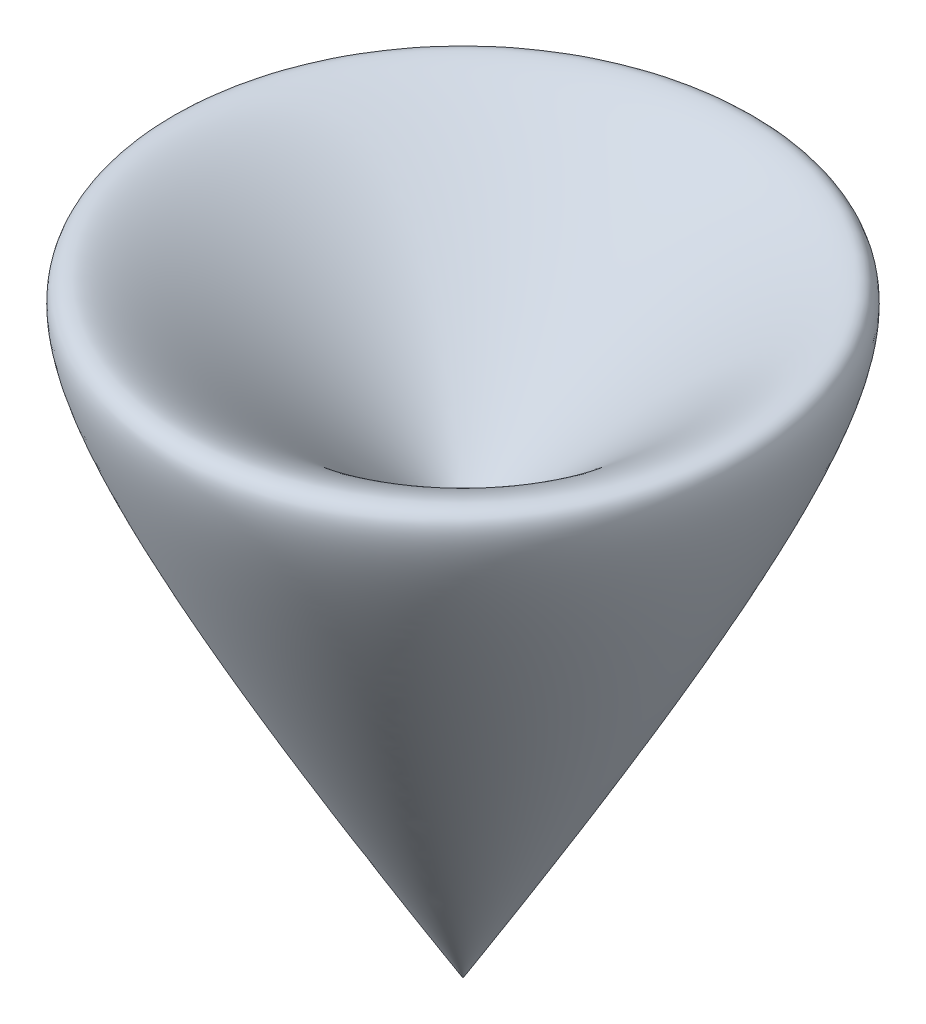
ISO-10303-21;
HEADER;
FILE_DESCRIPTION(('STEP AP214'),'2;1');
FILE_NAME('part.step','',(''),(''),'','','');
FILE_SCHEMA(('AUTOMOTIVE_DESIGN { 1 0 10303 214 1 1 1 1 }'));
ENDSEC;
DATA;
#1=APPLICATION_CONTEXT('core data for automotive mechanical design processes');
#2=APPLICATION_PROTOCOL_DEFINITION('international standard','automotive_design',2000,#1);
#3=PRODUCT_CONTEXT('',#1,'mechanical');
#4=PRODUCT('Part','Part','',(#3));
#5=PRODUCT_RELATED_PRODUCT_CATEGORY('part','',(#4));
#6=PRODUCT_DEFINITION_FORMATION('','',#4);
#7=PRODUCT_DEFINITION_CONTEXT('part definition',#1,'design');
#8=PRODUCT_DEFINITION('design','',#6,#7);
#9=PRODUCT_DEFINITION_SHAPE('','',#8);
#10=(LENGTH_UNIT() NAMED_UNIT(*) SI_UNIT(.MILLI.,.METRE.));
#11=(NAMED_UNIT(*) PLANE_ANGLE_UNIT() SI_UNIT($,.RADIAN.));
#12=(NAMED_UNIT(*) SI_UNIT($,.STERADIAN.) SOLID_ANGLE_UNIT());
#13=UNCERTAINTY_MEASURE_WITH_UNIT(LENGTH_MEASURE(1.E-05),#10,'distance_accuracy_value','');
#14=(GEOMETRIC_REPRESENTATION_CONTEXT(3) GLOBAL_UNCERTAINTY_ASSIGNED_CONTEXT((#13)) GLOBAL_UNIT_ASSIGNED_CONTEXT((#10,
#11,#12)) REPRESENTATION_CONTEXT('',''));
#15=CARTESIAN_POINT('',(0.,0.,0.));
#16=DIRECTION('',(0.,0.,1.));
#17=DIRECTION('',(1.,0.,0.));
#18=AXIS2_PLACEMENT_3D('',#15,#16,#17);
#19=CARTESIAN_POINT('',(0.,-38.5792372924863,0.));
#20=CARTESIAN_POINT('',(69.1013908625038,76.3646388694921,0.));
#21=CARTESIAN_POINT('',(0.,5.84533898371005,0.));
#22=B_SPLINE_CURVE_WITH_KNOTS('',2,(#19,#20,#21),.UNSPECIFIED.,.F.,.F.,(3,3),(0.,1.),.UNSPECIFIED.);
#23=CARTESIAN_POINT('',(0.,50.2699152599064,0.));
#24=DIRECTION('',(0.,1.,0.));
#25=AXIS1_PLACEMENT('',#23,#24);
#26=SURFACE_OF_REVOLUTION('',#22,#25);
#27=CARTESIAN_POINT('',(0.,5.84533898371005,0.));
#28=VERTEX_POINT('',#27);
#29=VERTEX_LOOP('',#28);
#30=FACE_BOUND('',#29,.T.);
#31=CARTESIAN_POINT('',(0.,-38.5792372924863,0.));
#32=VERTEX_POINT('',#31);
#33=VERTEX_LOOP('',#32);
#34=FACE_BOUND('',#33,.T.);
#35=ADVANCED_FACE('F36',(#30,#34),#26,.T.);
#36=CLOSED_SHELL('',(#35));
#37=MANIFOLD_SOLID_BREP('B2',#36);
#38=ADVANCED_BREP_SHAPE_REPRESENTATION('',(#18,#37),#14);
#39=SHAPE_DEFINITION_REPRESENTATION(#9,#38);
ENDSEC;
END-ISO-10303-21;
